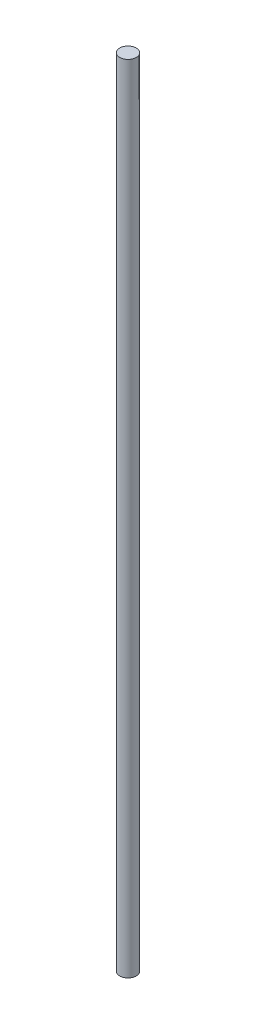
ISO-10303-21;
HEADER;
FILE_DESCRIPTION(('STEP AP214'),'2;1');
FILE_NAME('part.step','',(''),(''),'','','');
FILE_SCHEMA(('AUTOMOTIVE_DESIGN { 1 0 10303 214 1 1 1 1 }'));
ENDSEC;
DATA;
#1=APPLICATION_CONTEXT('core data for automotive mechanical design processes');
#2=APPLICATION_PROTOCOL_DEFINITION('international standard','automotive_design',2000,#1);
#3=PRODUCT_CONTEXT('',#1,'mechanical');
#4=PRODUCT('Part','Part','',(#3));
#5=PRODUCT_RELATED_PRODUCT_CATEGORY('part','',(#4));
#6=PRODUCT_DEFINITION_FORMATION('','',#4);
#7=PRODUCT_DEFINITION_CONTEXT('part definition',#1,'design');
#8=PRODUCT_DEFINITION('design','',#6,#7);
#9=PRODUCT_DEFINITION_SHAPE('','',#8);
#10=(LENGTH_UNIT() NAMED_UNIT(*) SI_UNIT(.MILLI.,.METRE.));
#11=(NAMED_UNIT(*) PLANE_ANGLE_UNIT() SI_UNIT($,.RADIAN.));
#12=(NAMED_UNIT(*) SI_UNIT($,.STERADIAN.) SOLID_ANGLE_UNIT());
#13=UNCERTAINTY_MEASURE_WITH_UNIT(LENGTH_MEASURE(1.E-05),#10,'distance_accuracy_value','');
#14=(GEOMETRIC_REPRESENTATION_CONTEXT(3) GLOBAL_UNCERTAINTY_ASSIGNED_CONTEXT((#13)) GLOBAL_UNIT_ASSIGNED_CONTEXT((#10,
#11,#12)) REPRESENTATION_CONTEXT('',''));
#15=CARTESIAN_POINT('',(0.,0.,0.));
#16=DIRECTION('',(0.,0.,1.));
#17=DIRECTION('',(1.,0.,0.));
#18=AXIS2_PLACEMENT_3D('',#15,#16,#17);
#19=CARTESIAN_POINT('',(-3.,0.,0.));
#20=DIRECTION('',(0.,-1.,0.));
#21=DIRECTION('',(0.,0.,-1.));
#22=AXIS2_PLACEMENT_3D('',#19,#20,#21);
#23=PLANE('',#22);
#24=CARTESIAN_POINT('',(-3.,0.,0.));
#25=DIRECTION('',(0.,1.,0.));
#26=DIRECTION('',(0.,0.,-1.));
#27=AXIS2_PLACEMENT_3D('',#24,#25,#26);
#28=CIRCLE('',#27,3.);
#29=CARTESIAN_POINT('',(-3.,0.,3.));
#30=VERTEX_POINT('',#29);
#31=EDGE_CURVE('E41',#30,#30,#28,.T.);
#32=ORIENTED_EDGE('',*,*,#31,.F.);
#33=EDGE_LOOP('',(#32));
#34=FACE_BOUND('',#33,.T.);
#35=ADVANCED_FACE('F17',(#34),#23,.T.);
#36=CARTESIAN_POINT('',(-3.,290.,0.));
#37=DIRECTION('',(0.,-1.,0.));
#38=DIRECTION('',(0.,0.,-1.));
#39=AXIS2_PLACEMENT_3D('',#36,#37,#38);
#40=PLANE('',#39);
#41=CARTESIAN_POINT('',(-3.,290.,0.));
#42=DIRECTION('',(0.,-1.,0.));
#43=DIRECTION('',(0.,0.,-1.));
#44=AXIS2_PLACEMENT_3D('',#41,#42,#43);
#45=CIRCLE('',#44,3.);
#46=CARTESIAN_POINT('',(-3.,290.,3.));
#47=VERTEX_POINT('',#46);
#48=EDGE_CURVE('E11',#47,#47,#45,.T.);
#49=ORIENTED_EDGE('',*,*,#48,.F.);
#50=EDGE_LOOP('',(#49));
#51=FACE_BOUND('',#50,.T.);
#52=ADVANCED_FACE('F60',(#51),#40,.F.);
#53=CARTESIAN_POINT('',(-3.,304.5,0.));
#54=DIRECTION('',(0.,-1.,0.));
#55=DIRECTION('',(0.,0.,-1.));
#56=AXIS2_PLACEMENT_3D('',#53,#54,#55);
#57=CYLINDRICAL_SURFACE('',#56,3.);
#58=ORIENTED_EDGE('',*,*,#31,.T.);
#59=DIRECTION('',(0.,1.,0.));
#60=VECTOR('',#59,1.);
#61=CARTESIAN_POINT('',(-3.,304.5,3.));
#62=LINE('',#61,#60);
#63=EDGE_CURVE('E20',#30,#47,#62,.T.);
#64=ORIENTED_EDGE('',*,*,#63,.T.);
#65=ORIENTED_EDGE('',*,*,#48,.T.);
#66=ORIENTED_EDGE('',*,*,#63,.F.);
#67=EDGE_LOOP('',(#58,#64,#65,#66));
#68=FACE_BOUND('',#67,.T.);
#69=ADVANCED_FACE('F39',(#68),#57,.T.);
#70=CLOSED_SHELL('',(#35,#52,#69));
#71=MANIFOLD_SOLID_BREP('B1',#70);
#72=ADVANCED_BREP_SHAPE_REPRESENTATION('',(#18,#71),#14);
#73=SHAPE_DEFINITION_REPRESENTATION(#9,#72);
ENDSEC;
END-ISO-10303-21;
